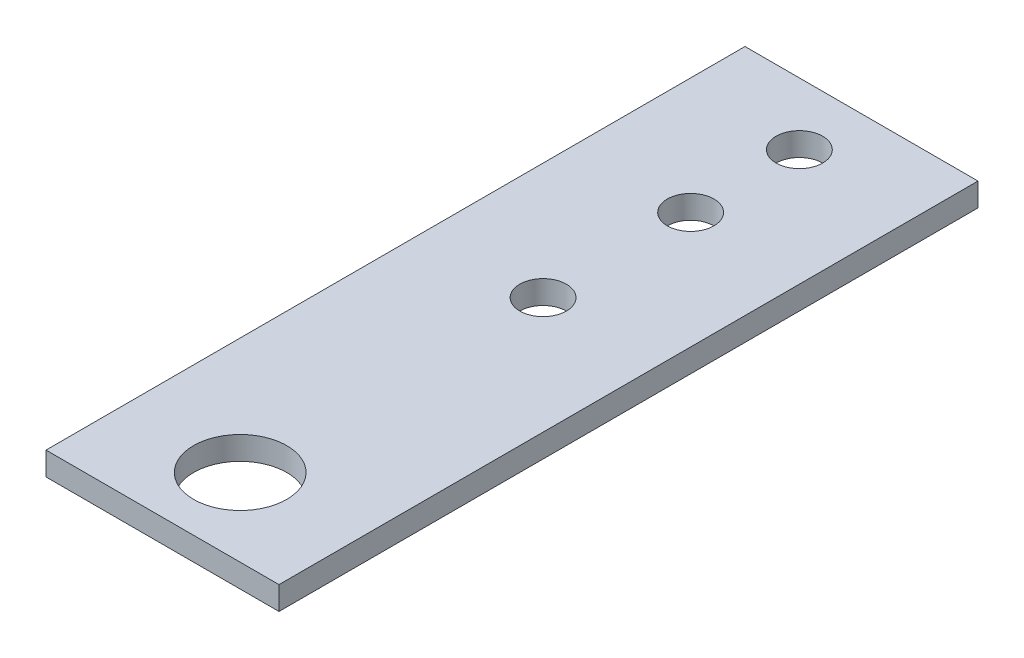
ISO-10303-21;
HEADER;
FILE_DESCRIPTION(('STEP AP214'),'2;1');
FILE_NAME('part.step','',(''),(''),'','','');
FILE_SCHEMA(('AUTOMOTIVE_DESIGN { 1 0 10303 214 1 1 1 1 }'));
ENDSEC;
DATA;
#1=APPLICATION_CONTEXT('core data for automotive mechanical design processes');
#2=APPLICATION_PROTOCOL_DEFINITION('international standard','automotive_design',2000,#1);
#3=PRODUCT_CONTEXT('',#1,'mechanical');
#4=PRODUCT('Part','Part','',(#3));
#5=PRODUCT_RELATED_PRODUCT_CATEGORY('part','',(#4));
#6=PRODUCT_DEFINITION_FORMATION('','',#4);
#7=PRODUCT_DEFINITION_CONTEXT('part definition',#1,'design');
#8=PRODUCT_DEFINITION('design','',#6,#7);
#9=PRODUCT_DEFINITION_SHAPE('','',#8);
#10=(LENGTH_UNIT() NAMED_UNIT(*) SI_UNIT(.MILLI.,.METRE.));
#11=(NAMED_UNIT(*) PLANE_ANGLE_UNIT() SI_UNIT($,.RADIAN.));
#12=(NAMED_UNIT(*) SI_UNIT($,.STERADIAN.) SOLID_ANGLE_UNIT());
#13=UNCERTAINTY_MEASURE_WITH_UNIT(LENGTH_MEASURE(1.E-05),#10,'distance_accuracy_value','');
#14=(GEOMETRIC_REPRESENTATION_CONTEXT(3) GLOBAL_UNCERTAINTY_ASSIGNED_CONTEXT((#13)) GLOBAL_UNIT_ASSIGNED_CONTEXT((#10,
#11,#12)) REPRESENTATION_CONTEXT('',''));
#15=CARTESIAN_POINT('',(0.,0.,0.));
#16=DIRECTION('',(0.,0.,1.));
#17=DIRECTION('',(1.,0.,0.));
#18=AXIS2_PLACEMENT_3D('',#15,#16,#17);
#19=CARTESIAN_POINT('',(-8.90931795878314,3.18168421052632,45.));
#20=DIRECTION('',(1.,0.,0.));
#21=DIRECTION('',(0.,0.,-1.));
#22=AXIS2_PLACEMENT_3D('',#19,#20,#21);
#23=PLANE('',#22);
#24=DIRECTION('',(0.,-1.,0.));
#25=VECTOR('',#24,1.);
#26=CARTESIAN_POINT('',(-8.90931795878314,3.18168421052632,0.));
#27=LINE('',#26,#25);
#28=CARTESIAN_POINT('',(-8.90931795878314,3.18168421052632,0.));
#29=VERTEX_POINT('',#28);
#30=CARTESIAN_POINT('',(-8.90931795878314,1.68168421052632,0.));
#31=VERTEX_POINT('',#30);
#32=EDGE_CURVE('E93',#29,#31,#27,.T.);
#33=ORIENTED_EDGE('',*,*,#32,.T.);
#34=DIRECTION('',(0.,0.,-1.));
#35=VECTOR('',#34,1.);
#36=CARTESIAN_POINT('',(-8.90931795878314,1.68168421052632,45.));
#37=LINE('',#36,#35);
#38=CARTESIAN_POINT('',(-8.90931795878314,1.68168421052632,45.));
#39=VERTEX_POINT('',#38);
#40=EDGE_CURVE('E11',#39,#31,#37,.T.);
#41=ORIENTED_EDGE('',*,*,#40,.F.);
#42=DIRECTION('',(0.,-1.,0.));
#43=VECTOR('',#42,1.);
#44=CARTESIAN_POINT('',(-8.90931795878314,3.18168421052632,45.));
#45=LINE('',#44,#43);
#46=CARTESIAN_POINT('',(-8.90931795878314,3.18168421052632,45.));
#47=VERTEX_POINT('',#46);
#48=EDGE_CURVE('E81',#47,#39,#45,.T.);
#49=ORIENTED_EDGE('',*,*,#48,.F.);
#50=DIRECTION('',(0.,0.,-1.));
#51=VECTOR('',#50,1.);
#52=CARTESIAN_POINT('',(-8.90931795878314,3.18168421052632,45.));
#53=LINE('',#52,#51);
#54=EDGE_CURVE('E89',#47,#29,#53,.T.);
#55=ORIENTED_EDGE('',*,*,#54,.T.);
#56=EDGE_LOOP('',(#33,#41,#49,#55));
#57=FACE_BOUND('',#56,.T.);
#58=ADVANCED_FACE('F30',(#57),#23,.F.);
#59=CARTESIAN_POINT('',(-8.90931795878314,1.68168421052632,45.));
#60=DIRECTION('',(0.,1.,0.));
#61=DIRECTION('',(0.,0.,1.));
#62=AXIS2_PLACEMENT_3D('',#59,#60,#61);
#63=PLANE('',#62);
#64=CARTESIAN_POINT('',(-1.40931795878314,1.68168421052632,20.5));
#65=DIRECTION('',(0.,1.,0.));
#66=DIRECTION('',(0.,0.,1.));
#67=AXIS2_PLACEMENT_3D('',#64,#65,#66);
#68=CIRCLE('',#67,1.5);
#69=CARTESIAN_POINT('',(-1.40931795878314,1.68168421052632,22.));
#70=VERTEX_POINT('',#69);
#71=EDGE_CURVE('E124',#70,#70,#68,.T.);
#72=ORIENTED_EDGE('',*,*,#71,.T.);
#73=EDGE_LOOP('',(#72));
#74=FACE_BOUND('',#73,.T.);
#75=CARTESIAN_POINT('',(-1.40931795878314,1.68168421052632,40.));
#76=DIRECTION('',(0.,1.,0.));
#77=DIRECTION('',(0.,0.,1.));
#78=AXIS2_PLACEMENT_3D('',#75,#76,#77);
#79=CIRCLE('',#78,3.);
#80=CARTESIAN_POINT('',(-1.40931795878314,1.68168421052632,43.));
#81=VERTEX_POINT('',#80);
#82=EDGE_CURVE('E118',#81,#81,#79,.T.);
#83=ORIENTED_EDGE('',*,*,#82,.T.);
#84=EDGE_LOOP('',(#83));
#85=FACE_BOUND('',#84,.T.);
#86=CARTESIAN_POINT('',(-1.40931795878314,1.68168421052632,11.));
#87=DIRECTION('',(0.,1.,0.));
#88=DIRECTION('',(0.,0.,1.));
#89=AXIS2_PLACEMENT_3D('',#86,#87,#88);
#90=CIRCLE('',#89,1.5);
#91=CARTESIAN_POINT('',(-1.40931795878314,1.68168421052632,12.5));
#92=VERTEX_POINT('',#91);
#93=EDGE_CURVE('E112',#92,#92,#90,.T.);
#94=ORIENTED_EDGE('',*,*,#93,.T.);
#95=EDGE_LOOP('',(#94));
#96=FACE_BOUND('',#95,.T.);
#97=CARTESIAN_POINT('',(-1.40931795878314,1.68168421052632,4.));
#98=DIRECTION('',(0.,1.,0.));
#99=DIRECTION('',(0.,0.,1.));
#100=AXIS2_PLACEMENT_3D('',#97,#98,#99);
#101=CIRCLE('',#100,1.5);
#102=CARTESIAN_POINT('',(-1.40931795878314,1.68168421052632,5.5));
#103=VERTEX_POINT('',#102);
#104=EDGE_CURVE('E96',#103,#103,#101,.T.);
#105=ORIENTED_EDGE('',*,*,#104,.T.);
#106=EDGE_LOOP('',(#105));
#107=FACE_BOUND('',#106,.T.);
#108=DIRECTION('',(1.,0.,0.));
#109=VECTOR('',#108,1.);
#110=CARTESIAN_POINT('',(-8.90931795878314,1.68168421052632,0.));
#111=LINE('',#110,#109);
#112=CARTESIAN_POINT('',(6.09068204121686,1.68168421052632,0.));
#113=VERTEX_POINT('',#112);
#114=EDGE_CURVE('E85',#31,#113,#111,.T.);
#115=ORIENTED_EDGE('',*,*,#114,.T.);
#116=DIRECTION('',(0.,0.,-1.));
#117=VECTOR('',#116,1.);
#118=CARTESIAN_POINT('',(6.09068204121686,1.68168421052632,45.));
#119=LINE('',#118,#117);
#120=CARTESIAN_POINT('',(6.09068204121686,1.68168421052632,45.));
#121=VERTEX_POINT('',#120);
#122=EDGE_CURVE('E38',#121,#113,#119,.T.);
#123=ORIENTED_EDGE('',*,*,#122,.F.);
#124=DIRECTION('',(1.,0.,0.));
#125=VECTOR('',#124,1.);
#126=CARTESIAN_POINT('',(-8.90931795878314,1.68168421052632,45.));
#127=LINE('',#126,#125);
#128=EDGE_CURVE('E76',#39,#121,#127,.T.);
#129=ORIENTED_EDGE('',*,*,#128,.F.);
#130=ORIENTED_EDGE('',*,*,#40,.T.);
#131=EDGE_LOOP('',(#115,#123,#129,#130));
#132=FACE_BOUND('',#131,.T.);
#133=ADVANCED_FACE('F84',(#74,#85,#96,#107,#132),#63,.F.);
#134=CARTESIAN_POINT('',(6.09068204121686,3.18168421052632,45.));
#135=DIRECTION('',(-1.,0.,0.));
#136=DIRECTION('',(0.,0.,1.));
#137=AXIS2_PLACEMENT_3D('',#134,#135,#136);
#138=PLANE('',#137);
#139=DIRECTION('',(0.,1.,0.));
#140=VECTOR('',#139,1.);
#141=CARTESIAN_POINT('',(6.09068204121686,3.18168421052632,0.));
#142=LINE('',#141,#140);
#143=CARTESIAN_POINT('',(6.09068204121686,3.18168421052632,0.));
#144=VERTEX_POINT('',#143);
#145=EDGE_CURVE('E63',#113,#144,#142,.T.);
#146=ORIENTED_EDGE('',*,*,#145,.T.);
#147=DIRECTION('',(0.,0.,-1.));
#148=VECTOR('',#147,1.);
#149=CARTESIAN_POINT('',(6.09068204121686,3.18168421052632,45.));
#150=LINE('',#149,#148);
#151=CARTESIAN_POINT('',(6.09068204121686,3.18168421052632,45.));
#152=VERTEX_POINT('',#151);
#153=EDGE_CURVE('E86',#152,#144,#150,.T.);
#154=ORIENTED_EDGE('',*,*,#153,.F.);
#155=DIRECTION('',(0.,1.,0.));
#156=VECTOR('',#155,1.);
#157=CARTESIAN_POINT('',(6.09068204121686,3.18168421052632,45.));
#158=LINE('',#157,#156);
#159=EDGE_CURVE('E79',#121,#152,#158,.T.);
#160=ORIENTED_EDGE('',*,*,#159,.F.);
#161=ORIENTED_EDGE('',*,*,#122,.T.);
#162=EDGE_LOOP('',(#146,#154,#160,#161));
#163=FACE_BOUND('',#162,.T.);
#164=ADVANCED_FACE('F87',(#163),#138,.F.);
#165=CARTESIAN_POINT('',(-8.90931795878314,3.18168421052632,45.));
#166=DIRECTION('',(0.,-1.,0.));
#167=DIRECTION('',(0.,0.,-1.));
#168=AXIS2_PLACEMENT_3D('',#165,#166,#167);
#169=PLANE('',#168);
#170=CARTESIAN_POINT('',(-1.40931795878314,3.18168421052632,20.5));
#171=DIRECTION('',(0.,1.,0.));
#172=DIRECTION('',(0.,0.,1.));
#173=AXIS2_PLACEMENT_3D('',#170,#171,#172);
#174=CIRCLE('',#173,1.5);
#175=CARTESIAN_POINT('',(-1.40931795878314,3.18168421052632,22.));
#176=VERTEX_POINT('',#175);
#177=EDGE_CURVE('E127',#176,#176,#174,.T.);
#178=ORIENTED_EDGE('',*,*,#177,.F.);
#179=EDGE_LOOP('',(#178));
#180=FACE_BOUND('',#179,.T.);
#181=CARTESIAN_POINT('',(-1.40931795878314,3.18168421052632,40.));
#182=DIRECTION('',(0.,1.,0.));
#183=DIRECTION('',(0.,0.,1.));
#184=AXIS2_PLACEMENT_3D('',#181,#182,#183);
#185=CIRCLE('',#184,3.);
#186=CARTESIAN_POINT('',(-1.40931795878314,3.18168421052632,43.));
#187=VERTEX_POINT('',#186);
#188=EDGE_CURVE('E121',#187,#187,#185,.T.);
#189=ORIENTED_EDGE('',*,*,#188,.F.);
#190=EDGE_LOOP('',(#189));
#191=FACE_BOUND('',#190,.T.);
#192=CARTESIAN_POINT('',(-1.40931795878314,3.18168421052632,11.));
#193=DIRECTION('',(0.,1.,0.));
#194=DIRECTION('',(0.,0.,1.));
#195=AXIS2_PLACEMENT_3D('',#192,#193,#194);
#196=CIRCLE('',#195,1.5);
#197=CARTESIAN_POINT('',(-1.40931795878314,3.18168421052632,12.5));
#198=VERTEX_POINT('',#197);
#199=EDGE_CURVE('E115',#198,#198,#196,.T.);
#200=ORIENTED_EDGE('',*,*,#199,.F.);
#201=EDGE_LOOP('',(#200));
#202=FACE_BOUND('',#201,.T.);
#203=CARTESIAN_POINT('',(-1.40931795878314,3.18168421052632,4.));
#204=DIRECTION('',(0.,1.,0.));
#205=DIRECTION('',(0.,0.,1.));
#206=AXIS2_PLACEMENT_3D('',#203,#204,#205);
#207=CIRCLE('',#206,1.5);
#208=CARTESIAN_POINT('',(-1.40931795878314,3.18168421052632,5.5));
#209=VERTEX_POINT('',#208);
#210=EDGE_CURVE('E109',#209,#209,#207,.T.);
#211=ORIENTED_EDGE('',*,*,#210,.F.);
#212=EDGE_LOOP('',(#211));
#213=FACE_BOUND('',#212,.T.);
#214=DIRECTION('',(-1.,0.,0.));
#215=VECTOR('',#214,1.);
#216=CARTESIAN_POINT('',(-8.90931795878314,3.18168421052632,0.));
#217=LINE('',#216,#215);
#218=EDGE_CURVE('E69',#144,#29,#217,.T.);
#219=ORIENTED_EDGE('',*,*,#218,.T.);
#220=ORIENTED_EDGE('',*,*,#54,.F.);
#221=DIRECTION('',(-1.,0.,0.));
#222=VECTOR('',#221,1.);
#223=CARTESIAN_POINT('',(-8.90931795878314,3.18168421052632,45.));
#224=LINE('',#223,#222);
#225=EDGE_CURVE('E46',#152,#47,#224,.T.);
#226=ORIENTED_EDGE('',*,*,#225,.F.);
#227=ORIENTED_EDGE('',*,*,#153,.T.);
#228=EDGE_LOOP('',(#219,#220,#226,#227));
#229=FACE_BOUND('',#228,.T.);
#230=ADVANCED_FACE('F101',(#180,#191,#202,#213,#229),#169,.F.);
#231=CARTESIAN_POINT('',(-8.90931795878314,1.68168421052632,45.));
#232=DIRECTION('',(0.,0.,1.));
#233=DIRECTION('',(1.,0.,0.));
#234=AXIS2_PLACEMENT_3D('',#231,#232,#233);
#235=PLANE('',#234);
#236=ORIENTED_EDGE('',*,*,#48,.T.);
#237=ORIENTED_EDGE('',*,*,#128,.T.);
#238=ORIENTED_EDGE('',*,*,#159,.T.);
#239=ORIENTED_EDGE('',*,*,#225,.T.);
#240=EDGE_LOOP('',(#236,#237,#238,#239));
#241=FACE_BOUND('',#240,.T.);
#242=ADVANCED_FACE('F77',(#241),#235,.T.);
#243=CARTESIAN_POINT('',(-8.90931795878314,1.68168421052632,0.));
#244=DIRECTION('',(0.,0.,1.));
#245=DIRECTION('',(1.,0.,0.));
#246=AXIS2_PLACEMENT_3D('',#243,#244,#245);
#247=PLANE('',#246);
#248=ORIENTED_EDGE('',*,*,#32,.F.);
#249=ORIENTED_EDGE('',*,*,#218,.F.);
#250=ORIENTED_EDGE('',*,*,#145,.F.);
#251=ORIENTED_EDGE('',*,*,#114,.F.);
#252=EDGE_LOOP('',(#248,#249,#250,#251));
#253=FACE_BOUND('',#252,.T.);
#254=ADVANCED_FACE('F104',(#253),#247,.F.);
#255=CARTESIAN_POINT('',(-1.40931795878314,-46.8183157894737,4.));
#256=DIRECTION('',(0.,1.,0.));
#257=DIRECTION('',(0.,0.,1.));
#258=AXIS2_PLACEMENT_3D('',#255,#256,#257);
#259=CYLINDRICAL_SURFACE('',#258,1.5);
#260=ORIENTED_EDGE('',*,*,#210,.T.);
#261=EDGE_LOOP('',(#260));
#262=FACE_BOUND('',#261,.T.);
#263=ORIENTED_EDGE('',*,*,#104,.F.);
#264=EDGE_LOOP('',(#263));
#265=FACE_BOUND('',#264,.T.);
#266=ADVANCED_FACE('F143',(#262,#265),#259,.F.);
#267=CARTESIAN_POINT('',(-1.40931795878314,-46.8183157894737,11.));
#268=DIRECTION('',(0.,1.,0.));
#269=DIRECTION('',(0.,0.,1.));
#270=AXIS2_PLACEMENT_3D('',#267,#268,#269);
#271=CYLINDRICAL_SURFACE('',#270,1.5);
#272=ORIENTED_EDGE('',*,*,#199,.T.);
#273=EDGE_LOOP('',(#272));
#274=FACE_BOUND('',#273,.T.);
#275=ORIENTED_EDGE('',*,*,#93,.F.);
#276=EDGE_LOOP('',(#275));
#277=FACE_BOUND('',#276,.T.);
#278=ADVANCED_FACE('F146',(#274,#277),#271,.F.);
#279=CARTESIAN_POINT('',(-1.40931795878314,-46.8183157894737,40.));
#280=DIRECTION('',(0.,1.,0.));
#281=DIRECTION('',(0.,0.,1.));
#282=AXIS2_PLACEMENT_3D('',#279,#280,#281);
#283=CYLINDRICAL_SURFACE('',#282,3.);
#284=ORIENTED_EDGE('',*,*,#188,.T.);
#285=EDGE_LOOP('',(#284));
#286=FACE_BOUND('',#285,.T.);
#287=ORIENTED_EDGE('',*,*,#82,.F.);
#288=EDGE_LOOP('',(#287));
#289=FACE_BOUND('',#288,.T.);
#290=ADVANCED_FACE('F165',(#286,#289),#283,.F.);
#291=CARTESIAN_POINT('',(-1.40931795878314,-46.8183157894737,20.5));
#292=DIRECTION('',(0.,1.,0.));
#293=DIRECTION('',(0.,0.,1.));
#294=AXIS2_PLACEMENT_3D('',#291,#292,#293);
#295=CYLINDRICAL_SURFACE('',#294,1.5);
#296=ORIENTED_EDGE('',*,*,#177,.T.);
#297=EDGE_LOOP('',(#296));
#298=FACE_BOUND('',#297,.T.);
#299=ORIENTED_EDGE('',*,*,#71,.F.);
#300=EDGE_LOOP('',(#299));
#301=FACE_BOUND('',#300,.T.);
#302=ADVANCED_FACE('F131',(#298,#301),#295,.F.);
#303=CLOSED_SHELL('',(#58,#133,#164,#230,#242,#254,#266,#278,#290,#302));
#304=MANIFOLD_SOLID_BREP('B2',#303);
#305=ADVANCED_BREP_SHAPE_REPRESENTATION('',(#18,#304),#14);
#306=SHAPE_DEFINITION_REPRESENTATION(#9,#305);
ENDSEC;
END-ISO-10303-21;
